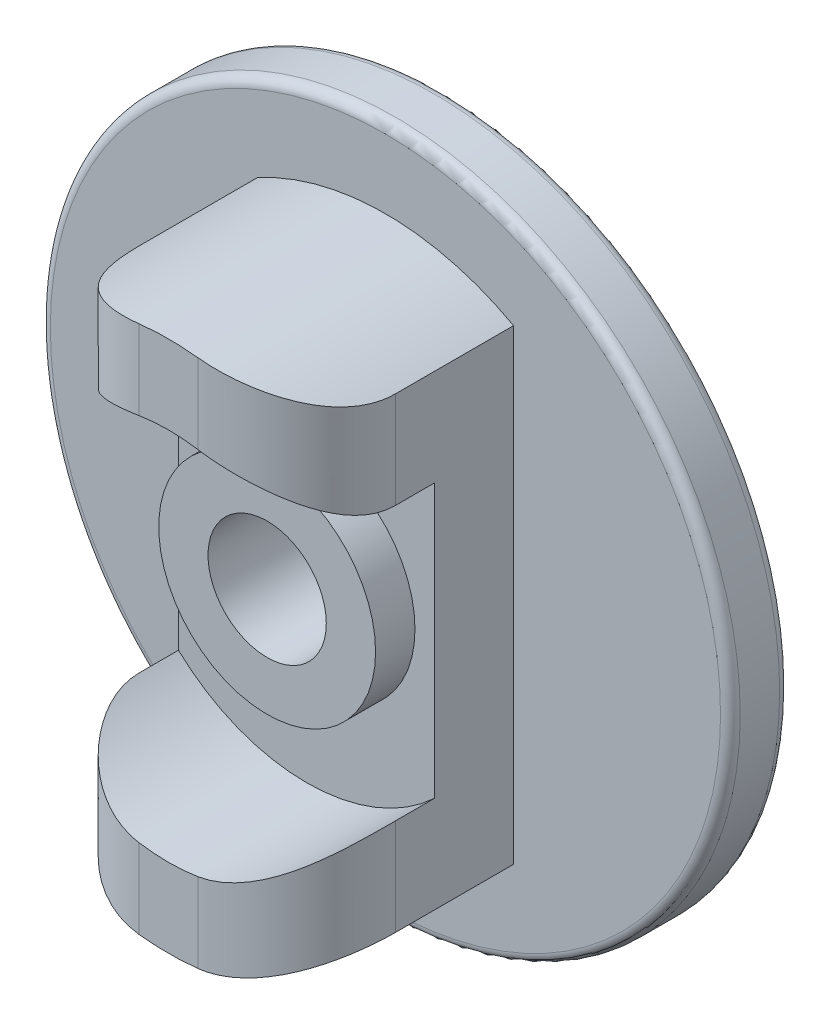
ISO-10303-21;
HEADER;
FILE_DESCRIPTION(('STEP AP214'),'2;1');
FILE_NAME('part.step','',(''),(''),'','','');
FILE_SCHEMA(('AUTOMOTIVE_DESIGN { 1 0 10303 214 1 1 1 1 }'));
ENDSEC;
DATA;
#1=APPLICATION_CONTEXT('core data for automotive mechanical design processes');
#2=APPLICATION_PROTOCOL_DEFINITION('international standard','automotive_design',2000,#1);
#3=PRODUCT_CONTEXT('',#1,'mechanical');
#4=PRODUCT('Part','Part','',(#3));
#5=PRODUCT_RELATED_PRODUCT_CATEGORY('part','',(#4));
#6=PRODUCT_DEFINITION_FORMATION('','',#4);
#7=PRODUCT_DEFINITION_CONTEXT('part definition',#1,'design');
#8=PRODUCT_DEFINITION('design','',#6,#7);
#9=PRODUCT_DEFINITION_SHAPE('','',#8);
#10=(LENGTH_UNIT() NAMED_UNIT(*) SI_UNIT(.MILLI.,.METRE.));
#11=(NAMED_UNIT(*) PLANE_ANGLE_UNIT() SI_UNIT($,.RADIAN.));
#12=(NAMED_UNIT(*) SI_UNIT($,.STERADIAN.) SOLID_ANGLE_UNIT());
#13=UNCERTAINTY_MEASURE_WITH_UNIT(LENGTH_MEASURE(1.E-05),#10,'distance_accuracy_value','');
#14=(GEOMETRIC_REPRESENTATION_CONTEXT(3) GLOBAL_UNCERTAINTY_ASSIGNED_CONTEXT((#13)) GLOBAL_UNIT_ASSIGNED_CONTEXT((#10,
#11,#12)) REPRESENTATION_CONTEXT('',''));
#15=CARTESIAN_POINT('',(0.,0.,0.));
#16=DIRECTION('',(0.,0.,1.));
#17=DIRECTION('',(1.,0.,0.));
#18=AXIS2_PLACEMENT_3D('',#15,#16,#17);
#19=CARTESIAN_POINT('',(0.,0.,14.));
#20=DIRECTION('',(0.,0.,1.));
#21=DIRECTION('',(1.,0.,0.));
#22=AXIS2_PLACEMENT_3D('',#19,#20,#21);
#23=PLANE('',#22);
#24=CARTESIAN_POINT('',(0.,0.,14.));
#25=DIRECTION('',(0.,0.,1.));
#26=DIRECTION('',(1.,0.,0.));
#27=AXIS2_PLACEMENT_3D('',#24,#25,#26);
#28=CIRCLE('',#27,13.5);
#29=CARTESIAN_POINT('',(1.50000000000002,13.4164078649988,14.));
#30=VERTEX_POINT('',#29);
#31=CARTESIAN_POINT('',(-1.5,13.4164078649987,14.));
#32=VERTEX_POINT('',#31);
#33=EDGE_CURVE('E308',#30,#32,#28,.T.);
#34=ORIENTED_EDGE('',*,*,#33,.T.);
#35=DIRECTION('',(0.,-1.,0.));
#36=VECTOR('',#35,1.);
#37=CARTESIAN_POINT('',(-1.5,6.92820323027551,14.));
#38=LINE('',#37,#36);
#39=CARTESIAN_POINT('',(-1.49999999999998,9.38083151964685,14.));
#40=VERTEX_POINT('',#39);
#41=EDGE_CURVE('E175',#32,#40,#38,.T.);
#42=ORIENTED_EDGE('',*,*,#41,.T.);
#43=CARTESIAN_POINT('',(0.,0.,14.));
#44=DIRECTION('',(0.,0.,1.));
#45=DIRECTION('',(1.,0.,0.));
#46=AXIS2_PLACEMENT_3D('',#43,#44,#45);
#47=CIRCLE('',#46,9.5);
#48=CARTESIAN_POINT('',(1.50000000000002,9.38083151964689,14.));
#49=VERTEX_POINT('',#48);
#50=EDGE_CURVE('E328',#49,#40,#47,.T.);
#51=ORIENTED_EDGE('',*,*,#50,.F.);
#52=DIRECTION('',(0.,1.,0.));
#53=VECTOR('',#52,1.);
#54=CARTESIAN_POINT('',(1.5,11.8321595661992,14.));
#55=LINE('',#54,#53);
#56=EDGE_CURVE('E172',#49,#30,#55,.T.);
#57=ORIENTED_EDGE('',*,*,#56,.T.);
#58=EDGE_LOOP('',(#34,#42,#51,#57));
#59=FACE_BOUND('',#58,.T.);
#60=ADVANCED_FACE('F34',(#59),#23,.T.);
#61=CARTESIAN_POINT('',(6.50000000000001,14.,14.));
#62=DIRECTION('',(-1.,0.,0.));
#63=DIRECTION('',(0.,-1.,0.));
#64=AXIS2_PLACEMENT_3D('',#61,#62,#63);
#65=PLANE('',#64);
#66=DIRECTION('',(0.,0.,1.));
#67=VECTOR('',#66,1.);
#68=CARTESIAN_POINT('',(6.50000000000003,11.8321595661992,3.));
#69=LINE('',#68,#67);
#70=CARTESIAN_POINT('',(6.50000000000003,11.8321595661992,8.99999999999999));
#71=VERTEX_POINT('',#70);
#72=CARTESIAN_POINT('',(6.50000000000003,11.8321595661992,3.));
#73=VERTEX_POINT('',#72);
#74=EDGE_CURVE('E125',#71,#73,#69,.F.);
#75=ORIENTED_EDGE('',*,*,#74,.F.);
#76=DIRECTION('',(0.,1.,0.));
#77=VECTOR('',#76,1.);
#78=CARTESIAN_POINT('',(6.50000000000001,6.92820323027554,8.99999999999999));
#79=LINE('',#78,#77);
#80=CARTESIAN_POINT('',(6.50000000000001,6.92820323027554,8.99999999999999));
#81=VERTEX_POINT('',#80);
#82=EDGE_CURVE('E343',#71,#81,#79,.F.);
#83=ORIENTED_EDGE('',*,*,#82,.T.);
#84=DIRECTION('',(0.,0.,1.));
#85=VECTOR('',#84,1.);
#86=CARTESIAN_POINT('',(6.50000000000001,6.92820323027554,7.));
#87=LINE('',#86,#85);
#88=CARTESIAN_POINT('',(6.50000000000001,6.92820323027554,7.));
#89=VERTEX_POINT('',#88);
#90=EDGE_CURVE('E337',#81,#89,#87,.F.);
#91=ORIENTED_EDGE('',*,*,#90,.T.);
#92=DIRECTION('',(0.,1.,0.));
#93=VECTOR('',#92,1.);
#94=CARTESIAN_POINT('',(6.50000000000001,14.,7.));
#95=LINE('',#94,#93);
#96=CARTESIAN_POINT('',(6.5,-6.92820323027551,7.));
#97=VERTEX_POINT('',#96);
#98=EDGE_CURVE('E153',#97,#89,#95,.T.);
#99=ORIENTED_EDGE('',*,*,#98,.F.);
#100=DIRECTION('',(0.,0.,1.));
#101=VECTOR('',#100,1.);
#102=CARTESIAN_POINT('',(6.5,-6.92820323027551,7.));
#103=LINE('',#102,#101);
#104=CARTESIAN_POINT('',(6.5,-6.92820323027551,8.99999999999999));
#105=VERTEX_POINT('',#104);
#106=EDGE_CURVE('E158',#97,#105,#103,.T.);
#107=ORIENTED_EDGE('',*,*,#106,.T.);
#108=DIRECTION('',(0.,1.,0.));
#109=VECTOR('',#108,1.);
#110=CARTESIAN_POINT('',(6.5,-11.8321595661992,8.99999999999999));
#111=LINE('',#110,#109);
#112=CARTESIAN_POINT('',(6.5,-11.8321595661992,8.99999999999999));
#113=VERTEX_POINT('',#112);
#114=EDGE_CURVE('E266',#105,#113,#111,.F.);
#115=ORIENTED_EDGE('',*,*,#114,.T.);
#116=DIRECTION('',(0.,0.,1.));
#117=VECTOR('',#116,1.);
#118=CARTESIAN_POINT('',(6.5,-11.8321595661992,3.));
#119=LINE('',#118,#117);
#120=CARTESIAN_POINT('',(6.5,-11.8321595661992,3.));
#121=VERTEX_POINT('',#120);
#122=EDGE_CURVE('E136',#121,#113,#119,.T.);
#123=ORIENTED_EDGE('',*,*,#122,.F.);
#124=DIRECTION('',(0.,1.,0.));
#125=VECTOR('',#124,1.);
#126=CARTESIAN_POINT('',(6.50000000000001,14.,3.));
#127=LINE('',#126,#125);
#128=EDGE_CURVE('E144',#121,#73,#127,.T.);
#129=ORIENTED_EDGE('',*,*,#128,.T.);
#130=EDGE_LOOP('',(#75,#83,#91,#99,#107,#115,#123,#129));
#131=FACE_BOUND('',#130,.T.);
#132=ADVANCED_FACE('F151',(#131),#65,.F.);
#133=CARTESIAN_POINT('',(-6.5,14.,14.));
#134=DIRECTION('',(1.,0.,0.));
#135=DIRECTION('',(0.,1.,0.));
#136=AXIS2_PLACEMENT_3D('',#133,#134,#135);
#137=PLANE('',#136);
#138=DIRECTION('',(0.,0.,1.));
#139=VECTOR('',#138,1.);
#140=CARTESIAN_POINT('',(-6.5,6.92820323027551,7.));
#141=LINE('',#140,#139);
#142=CARTESIAN_POINT('',(-6.5,6.92820323027551,7.));
#143=VERTEX_POINT('',#142);
#144=CARTESIAN_POINT('',(-6.5,6.92820323027551,8.99999999999999));
#145=VERTEX_POINT('',#144);
#146=EDGE_CURVE('E323',#143,#145,#141,.T.);
#147=ORIENTED_EDGE('',*,*,#146,.T.);
#148=DIRECTION('',(0.,-1.,0.));
#149=VECTOR('',#148,1.);
#150=CARTESIAN_POINT('',(-6.5,11.8321595661992,8.99999999999999));
#151=LINE('',#150,#149);
#152=CARTESIAN_POINT('',(-6.5,11.8321595661992,8.99999999999999));
#153=VERTEX_POINT('',#152);
#154=EDGE_CURVE('E317',#145,#153,#151,.F.);
#155=ORIENTED_EDGE('',*,*,#154,.T.);
#156=DIRECTION('',(0.,0.,1.));
#157=VECTOR('',#156,1.);
#158=CARTESIAN_POINT('',(-6.5,11.8321595661992,3.));
#159=LINE('',#158,#157);
#160=CARTESIAN_POINT('',(-6.5,11.8321595661992,3.));
#161=VERTEX_POINT('',#160);
#162=EDGE_CURVE('E137',#161,#153,#159,.T.);
#163=ORIENTED_EDGE('',*,*,#162,.F.);
#164=DIRECTION('',(0.,-1.,0.));
#165=VECTOR('',#164,1.);
#166=CARTESIAN_POINT('',(-6.5,14.,3.));
#167=LINE('',#166,#165);
#168=CARTESIAN_POINT('',(-6.50000000000005,-11.8321595661993,3.));
#169=VERTEX_POINT('',#168);
#170=EDGE_CURVE('E146',#161,#169,#167,.T.);
#171=ORIENTED_EDGE('',*,*,#170,.T.);
#172=DIRECTION('',(0.,0.,1.));
#173=VECTOR('',#172,1.);
#174=CARTESIAN_POINT('',(-6.50000000000005,-11.8321595661993,3.));
#175=LINE('',#174,#173);
#176=CARTESIAN_POINT('',(-6.50000000000005,-11.8321595661993,8.99999999999999));
#177=VERTEX_POINT('',#176);
#178=EDGE_CURVE('E147',#177,#169,#175,.F.);
#179=ORIENTED_EDGE('',*,*,#178,.F.);
#180=DIRECTION('',(0.,-1.,0.));
#181=VECTOR('',#180,1.);
#182=CARTESIAN_POINT('',(-6.50000000000004,-6.92820323027551,8.99999999999999));
#183=LINE('',#182,#181);
#184=CARTESIAN_POINT('',(-6.50000000000004,-6.92820323027551,8.99999999999999));
#185=VERTEX_POINT('',#184);
#186=EDGE_CURVE('E319',#177,#185,#183,.F.);
#187=ORIENTED_EDGE('',*,*,#186,.T.);
#188=DIRECTION('',(0.,0.,1.));
#189=VECTOR('',#188,1.);
#190=CARTESIAN_POINT('',(-6.50000000000004,-6.92820323027551,7.));
#191=LINE('',#190,#189);
#192=CARTESIAN_POINT('',(-6.50000000000004,-6.92820323027551,7.));
#193=VERTEX_POINT('',#192);
#194=EDGE_CURVE('E332',#185,#193,#191,.F.);
#195=ORIENTED_EDGE('',*,*,#194,.T.);
#196=DIRECTION('',(0.,-1.,0.));
#197=VECTOR('',#196,1.);
#198=CARTESIAN_POINT('',(-6.5,14.,7.));
#199=LINE('',#198,#197);
#200=EDGE_CURVE('E166',#143,#193,#199,.T.);
#201=ORIENTED_EDGE('',*,*,#200,.F.);
#202=EDGE_LOOP('',(#147,#155,#163,#171,#179,#187,#195,#201));
#203=FACE_BOUND('',#202,.T.);
#204=ADVANCED_FACE('F295',(#203),#137,.F.);
#205=CARTESIAN_POINT('',(0.,0.,14.));
#206=DIRECTION('',(0.,0.,1.));
#207=DIRECTION('',(1.,0.,0.));
#208=AXIS2_PLACEMENT_3D('',#205,#206,#207);
#209=CIRCLE('',#208,9.5);
#210=CARTESIAN_POINT('',(-1.50000000000002,-9.38083151964687,14.));
#211=VERTEX_POINT('',#210);
#212=CARTESIAN_POINT('',(1.49999999999999,-9.38083151964687,14.));
#213=VERTEX_POINT('',#212);
#214=EDGE_CURVE('E164',#211,#213,#209,.T.);
#215=ORIENTED_EDGE('',*,*,#214,.F.);
#216=DIRECTION('',(0.,-1.,0.));
#217=VECTOR('',#216,1.);
#218=CARTESIAN_POINT('',(-1.50000000000004,-11.8321595661993,14.));
#219=LINE('',#218,#217);
#220=CARTESIAN_POINT('',(-1.5,-13.4164078649987,14.));
#221=VERTEX_POINT('',#220);
#222=EDGE_CURVE('E242',#211,#221,#219,.T.);
#223=ORIENTED_EDGE('',*,*,#222,.T.);
#224=CARTESIAN_POINT('',(0.,0.,14.));
#225=DIRECTION('',(0.,0.,1.));
#226=DIRECTION('',(1.,0.,0.));
#227=AXIS2_PLACEMENT_3D('',#224,#225,#226);
#228=CIRCLE('',#227,13.5);
#229=CARTESIAN_POINT('',(1.49999999999999,-13.4164078649987,14.));
#230=VERTEX_POINT('',#229);
#231=EDGE_CURVE('E169',#221,#230,#228,.T.);
#232=ORIENTED_EDGE('',*,*,#231,.T.);
#233=DIRECTION('',(0.,1.,0.));
#234=VECTOR('',#233,1.);
#235=CARTESIAN_POINT('',(1.49999999999999,-6.92820323027551,14.));
#236=LINE('',#235,#234);
#237=EDGE_CURVE('E344',#230,#213,#236,.T.);
#238=ORIENTED_EDGE('',*,*,#237,.T.);
#239=EDGE_LOOP('',(#215,#223,#232,#238));
#240=FACE_BOUND('',#239,.T.);
#241=ADVANCED_FACE('F277',(#240),#23,.T.);
#242=CARTESIAN_POINT('',(0.,0.,3.));
#243=DIRECTION('',(0.,0.,-1.));
#244=DIRECTION('',(-1.,0.,0.));
#245=AXIS2_PLACEMENT_3D('',#242,#243,#244);
#246=CYLINDRICAL_SURFACE('',#245,17.5);
#247=CARTESIAN_POINT('',(0.,0.,0.5));
#248=DIRECTION('',(0.,0.,1.));
#249=DIRECTION('',(1.,0.,0.));
#250=AXIS2_PLACEMENT_3D('',#247,#248,#249);
#251=CIRCLE('',#250,17.5);
#252=CARTESIAN_POINT('',(17.5,0.,0.5));
#253=VERTEX_POINT('',#252);
#254=EDGE_CURVE('E42',#253,#253,#251,.T.);
#255=ORIENTED_EDGE('',*,*,#254,.T.);
#256=EDGE_LOOP('',(#255));
#257=FACE_BOUND('',#256,.T.);
#258=CARTESIAN_POINT('',(0.,0.,2.5));
#259=DIRECTION('',(0.,0.,1.));
#260=DIRECTION('',(1.,0.,0.));
#261=AXIS2_PLACEMENT_3D('',#258,#259,#260);
#262=CIRCLE('',#261,17.5);
#263=CARTESIAN_POINT('',(17.5,0.,2.5));
#264=VERTEX_POINT('',#263);
#265=EDGE_CURVE('E395',#264,#264,#262,.F.);
#266=ORIENTED_EDGE('',*,*,#265,.T.);
#267=EDGE_LOOP('',(#266));
#268=FACE_BOUND('',#267,.T.);
#269=ADVANCED_FACE('F273',(#257,#268),#246,.T.);
#270=CARTESIAN_POINT('',(0.,0.,3.));
#271=DIRECTION('',(0.,0.,1.));
#272=DIRECTION('',(1.,0.,0.));
#273=AXIS2_PLACEMENT_3D('',#270,#271,#272);
#274=PLANE('',#273);
#275=CARTESIAN_POINT('',(0.,0.,3.));
#276=DIRECTION('',(0.,0.,1.));
#277=DIRECTION('',(1.,0.,0.));
#278=AXIS2_PLACEMENT_3D('',#275,#276,#277);
#279=CIRCLE('',#278,17.);
#280=CARTESIAN_POINT('',(17.,0.,3.));
#281=VERTEX_POINT('',#280);
#282=EDGE_CURVE('E11',#281,#281,#279,.T.);
#283=ORIENTED_EDGE('',*,*,#282,.T.);
#284=EDGE_LOOP('',(#283));
#285=FACE_BOUND('',#284,.T.);
#286=ORIENTED_EDGE('',*,*,#128,.F.);
#287=CARTESIAN_POINT('',(0.,0.,3.));
#288=DIRECTION('',(0.,0.,1.));
#289=DIRECTION('',(1.,0.,0.));
#290=AXIS2_PLACEMENT_3D('',#287,#288,#289);
#291=CIRCLE('',#290,13.5);
#292=EDGE_CURVE('E148',#169,#121,#291,.T.);
#293=ORIENTED_EDGE('',*,*,#292,.F.);
#294=ORIENTED_EDGE('',*,*,#170,.F.);
#295=EDGE_CURVE('E129',#73,#161,#291,.T.);
#296=ORIENTED_EDGE('',*,*,#295,.F.);
#297=EDGE_LOOP('',(#286,#293,#294,#296));
#298=FACE_BOUND('',#297,.T.);
#299=ADVANCED_FACE('F142',(#285,#298),#274,.T.);
#300=CARTESIAN_POINT('',(0.,0.,0.));
#301=DIRECTION('',(0.,0.,1.));
#302=DIRECTION('',(1.,0.,0.));
#303=AXIS2_PLACEMENT_3D('',#300,#301,#302);
#304=PLANE('',#303);
#305=CARTESIAN_POINT('',(0.,0.,0.));
#306=DIRECTION('',(0.,0.,1.));
#307=DIRECTION('',(1.,0.,0.));
#308=AXIS2_PLACEMENT_3D('',#305,#306,#307);
#309=CIRCLE('',#308,16.);
#310=CARTESIAN_POINT('',(16.,0.,0.));
#311=VERTEX_POINT('',#310);
#312=EDGE_CURVE('E390',#311,#311,#309,.T.);
#313=ORIENTED_EDGE('',*,*,#312,.T.);
#314=EDGE_LOOP('',(#313));
#315=FACE_BOUND('',#314,.T.);
#316=CARTESIAN_POINT('',(0.,0.,0.));
#317=DIRECTION('',(0.,0.,1.));
#318=DIRECTION('',(1.,0.,0.));
#319=AXIS2_PLACEMENT_3D('',#316,#317,#318);
#320=CIRCLE('',#319,17.);
#321=CARTESIAN_POINT('',(17.,0.,0.));
#322=VERTEX_POINT('',#321);
#323=EDGE_CURVE('E387',#322,#322,#320,.F.);
#324=ORIENTED_EDGE('',*,*,#323,.T.);
#325=EDGE_LOOP('',(#324));
#326=FACE_BOUND('',#325,.T.);
#327=ADVANCED_FACE('F279',(#315,#326),#304,.F.);
#328=CARTESIAN_POINT('',(0.,0.,1.));
#329=DIRECTION('',(0.,0.,-1.));
#330=DIRECTION('',(-1.,0.,0.));
#331=AXIS2_PLACEMENT_3D('',#328,#329,#330);
#332=CYLINDRICAL_SURFACE('',#331,15.5);
#333=CARTESIAN_POINT('',(0.,0.,0.5));
#334=DIRECTION('',(0.,0.,1.));
#335=DIRECTION('',(1.,0.,0.));
#336=AXIS2_PLACEMENT_3D('',#333,#334,#335);
#337=CIRCLE('',#336,15.5);
#338=CARTESIAN_POINT('',(15.5,0.,0.5));
#339=VERTEX_POINT('',#338);
#340=EDGE_CURVE('E385',#339,#339,#337,.F.);
#341=ORIENTED_EDGE('',*,*,#340,.T.);
#342=EDGE_LOOP('',(#341));
#343=FACE_BOUND('',#342,.T.);
#344=CARTESIAN_POINT('',(0.,0.,1.));
#345=DIRECTION('',(0.,0.,-1.));
#346=DIRECTION('',(-1.,0.,0.));
#347=AXIS2_PLACEMENT_3D('',#344,#345,#346);
#348=CIRCLE('',#347,15.5);
#349=CARTESIAN_POINT('',(-15.5,0.,1.));
#350=VERTEX_POINT('',#349);
#351=EDGE_CURVE('E155',#350,#350,#348,.T.);
#352=ORIENTED_EDGE('',*,*,#351,.F.);
#353=EDGE_LOOP('',(#352));
#354=FACE_BOUND('',#353,.T.);
#355=ADVANCED_FACE('F282',(#343,#354),#332,.F.);
#356=CARTESIAN_POINT('',(0.,0.,1.));
#357=DIRECTION('',(0.,0.,-1.));
#358=DIRECTION('',(-1.,0.,0.));
#359=AXIS2_PLACEMENT_3D('',#356,#357,#358);
#360=PLANE('',#359);
#361=CARTESIAN_POINT('',(0.,0.,1.));
#362=DIRECTION('',(0.,0.,-1.));
#363=DIRECTION('',(-1.,0.,0.));
#364=AXIS2_PLACEMENT_3D('',#361,#362,#363);
#365=CIRCLE('',#364,3.);
#366=CARTESIAN_POINT('',(-3.00000000000001,0.,1.));
#367=VERTEX_POINT('',#366);
#368=EDGE_CURVE('E354',#367,#367,#365,.T.);
#369=ORIENTED_EDGE('',*,*,#368,.F.);
#370=EDGE_LOOP('',(#369));
#371=FACE_BOUND('',#370,.T.);
#372=ORIENTED_EDGE('',*,*,#351,.T.);
#373=EDGE_LOOP('',(#372));
#374=FACE_BOUND('',#373,.T.);
#375=ADVANCED_FACE('F289',(#371,#374),#360,.T.);
#376=CARTESIAN_POINT('',(0.,0.,7.));
#377=DIRECTION('',(0.,0.,1.));
#378=DIRECTION('',(1.,0.,0.));
#379=AXIS2_PLACEMENT_3D('',#376,#377,#378);
#380=PLANE('',#379);
#381=CARTESIAN_POINT('',(0.,0.,7.));
#382=DIRECTION('',(0.,0.,1.));
#383=DIRECTION('',(1.,0.,0.));
#384=AXIS2_PLACEMENT_3D('',#381,#382,#383);
#385=CIRCLE('',#384,5.5);
#386=CARTESIAN_POINT('',(5.50000000000001,0.,7.));
#387=VERTEX_POINT('',#386);
#388=EDGE_CURVE('E351',#387,#387,#385,.T.);
#389=ORIENTED_EDGE('',*,*,#388,.F.);
#390=EDGE_LOOP('',(#389));
#391=FACE_BOUND('',#390,.T.);
#392=ORIENTED_EDGE('',*,*,#98,.T.);
#393=CARTESIAN_POINT('',(0.,0.,7.));
#394=DIRECTION('',(0.,0.,1.));
#395=DIRECTION('',(1.,0.,0.));
#396=AXIS2_PLACEMENT_3D('',#393,#394,#395);
#397=CIRCLE('',#396,9.5);
#398=EDGE_CURVE('E329',#89,#143,#397,.T.);
#399=ORIENTED_EDGE('',*,*,#398,.T.);
#400=ORIENTED_EDGE('',*,*,#200,.T.);
#401=EDGE_CURVE('E333',#193,#97,#397,.T.);
#402=ORIENTED_EDGE('',*,*,#401,.T.);
#403=EDGE_LOOP('',(#392,#399,#400,#402));
#404=FACE_BOUND('',#403,.T.);
#405=ADVANCED_FACE('F202',(#391,#404),#380,.T.);
#406=CARTESIAN_POINT('',(0.,0.,7.));
#407=DIRECTION('',(0.,0.,1.));
#408=DIRECTION('',(1.,0.,0.));
#409=AXIS2_PLACEMENT_3D('',#406,#407,#408);
#410=CYLINDRICAL_SURFACE('',#409,9.5);
#411=ORIENTED_EDGE('',*,*,#194,.F.);
#412=CARTESIAN_POINT('',(-6.50000000000004,-6.92820323027551,8.99999999999999));
#413=CARTESIAN_POINT('',(-6.5000320521124,-6.92814283840357,9.12030380158095));
#414=CARTESIAN_POINT('',(-6.49565949680199,-6.93227505330145,9.24056863593133));
#415=CARTESIAN_POINT('',(-6.47836060075672,-6.94845987766344,9.47979470262765));
#416=CARTESIAN_POINT('',(-6.46544525857244,-6.96050230286007,9.59875741148492));
#417=CARTESIAN_POINT('',(-6.43148594493999,-6.99188696500527,9.83328787181541));
#418=CARTESIAN_POINT('',(-6.41052468002583,-7.01115488387362,9.94887769215033));
#419=CARTESIAN_POINT('',(-6.36087806235677,-7.05622838580483,10.1770781997922));
#420=CARTESIAN_POINT('',(-6.3321906086426,-7.0820357470055,10.2896880676087));
#421=CARTESIAN_POINT('',(-6.23553437619206,-7.16766989867722,10.620913588169));
#422=CARTESIAN_POINT('',(-6.15676424103778,-7.23591081359361,10.8343026539286));
#423=CARTESIAN_POINT('',(-5.97367942474763,-7.3877801136041,11.2443000062161));
#424=CARTESIAN_POINT('',(-5.86929454883077,-7.47145062276511,11.4408601434941));
#425=CARTESIAN_POINT('',(-5.62033041543343,-7.66093152846847,11.8437740407077));
#426=CARTESIAN_POINT('',(-5.47206983969242,-7.76818004691898,12.0471696888197));
#427=CARTESIAN_POINT('',(-5.14800813945533,-7.98662695662914,12.4285087775791));
#428=CARTESIAN_POINT('',(-4.97218906267865,-8.09782788581532,12.6064354815606));
#429=CARTESIAN_POINT('',(-4.66982131461535,-8.27406878579117,12.8697592120123));
#430=CARTESIAN_POINT('',(-4.55128864293033,-8.33997097494751,12.9639199671192));
#431=CARTESIAN_POINT('',(-4.30530292468334,-8.4695735100889,13.1416543622554));
#432=CARTESIAN_POINT('',(-4.17784752063182,-8.53327326747417,13.225225187788));
#433=CARTESIAN_POINT('',(-3.91478420293592,-8.65711101625794,13.3808832351648));
#434=CARTESIAN_POINT('',(-3.77918958284351,-8.71725451329553,13.4529885162531));
#435=CARTESIAN_POINT('',(-3.50038486617755,-8.83289636532303,13.5850003393489));
#436=CARTESIAN_POINT('',(-3.35717955112895,-8.88839758176597,13.6449144290026));
#437=CARTESIAN_POINT('',(-3.07729126689408,-8.98890047932762,13.746816609569));
#438=CARTESIAN_POINT('',(-2.94119962071748,-9.03439799149771,13.7899394485499));
#439=CARTESIAN_POINT('',(-2.66424406297507,-9.11991282183186,13.8646793017535));
#440=CARTESIAN_POINT('',(-2.5233815070118,-9.15993168066889,13.8962995548243));
#441=CARTESIAN_POINT('',(-2.2369090057206,-9.23407914993435,13.947550194762));
#442=CARTESIAN_POINT('',(-2.09127347735431,-9.26816627669305,13.967098400247));
#443=CARTESIAN_POINT('',(-1.79730301071984,-9.32965545947829,13.9933449648917));
#444=CARTESIAN_POINT('',(-1.64896540823367,-9.3570504856893,14.0000298618457));
#445=CARTESIAN_POINT('',(-1.50000000000002,-9.38083151964687,14.));
#446=B_SPLINE_CURVE_WITH_KNOTS('',3,(#412,#413,#414,#415,#416,#417,#418,#419,#420,#421,#422,
#423,#424,#425,#426,#427,#428,#429,#430,#431,#432,#433,#434,#435,#436,#437,#438,#439,#440,#441,
#442,#443,#444,#445),.UNSPECIFIED.,.F.,.F.,(4,2,2,2,2,2,2,2,2,2,2,2,2,2,2,2,4),(0.,
0.36069823179494,0.720932978311853,1.07755984927857,1.43428379480217,2.14356380546601,
2.85480967387222,3.67280823905639,4.49134190019005,4.9861383795286,5.48106608686214,
5.97520634780178,6.46903974616573,6.91796026243399,7.36675427559004,7.81857074765402,
8.27085981548523),.UNSPECIFIED.);
#447=EDGE_CURVE('E57',#185,#211,#446,.T.);
#448=ORIENTED_EDGE('',*,*,#447,.T.);
#449=ORIENTED_EDGE('',*,*,#214,.T.);
#450=CARTESIAN_POINT('',(1.49999999999999,-9.38083151964687,14.));
#451=CARTESIAN_POINT('',(1.63770772671039,-9.3588405592717,14.0000224064928));
#452=CARTESIAN_POINT('',(1.77488743479732,-9.33376844342896,13.9943125149502));
#453=CARTESIAN_POINT('',(2.04704908941457,-9.27786236733786,13.971851263545));
#454=CARTESIAN_POINT('',(2.1820326267127,-9.24703279970992,13.9551082968522));
#455=CARTESIAN_POINT('',(2.44804906603483,-9.18018467088469,13.9111389187246));
#456=CARTESIAN_POINT('',(2.57910121123306,-9.14419931509961,13.8839778576151));
#457=CARTESIAN_POINT('',(2.83729884392394,-9.06740716102843,13.8196818012185));
#458=CARTESIAN_POINT('',(2.9644436878862,-9.02659957382932,13.7825451726682));
#459=CARTESIAN_POINT('',(3.21372090933907,-8.94087889088581,13.698977382017));
#460=CARTESIAN_POINT('',(3.33586762529893,-8.89597893675818,13.6525754387579));
#461=CARTESIAN_POINT('',(3.57503199906829,-8.80259350280225,13.5509491108842));
#462=CARTESIAN_POINT('',(3.692047830392,-8.75410676239609,13.4957216165371));
#463=CARTESIAN_POINT('',(4.03496859131777,-8.60413932568484,13.3174466486942));
#464=CARTESIAN_POINT('',(4.25254688163383,-8.49822168674641,13.1818748358381));
#465=CARTESIAN_POINT('',(4.68483979738341,-8.26852363378006,12.8647526817297));
#466=CARTESIAN_POINT('',(4.89669934728691,-8.14405026687353,12.6798153068791));
#467=CARTESIAN_POINT('',(5.18932404431073,-7.95828826003485,12.3776561359306));
#468=CARTESIAN_POINT('',(5.28273212541104,-7.8964795762716,12.2727228414471));
#469=CARTESIAN_POINT('',(5.46077981012711,-7.7744154617515,12.0548377394131));
#470=CARTESIAN_POINT('',(5.54541940931267,-7.71416003177944,11.9418859278114));
#471=CARTESIAN_POINT('',(5.76747660091004,-7.55096962763436,11.6175862557266));
#472=CARTESIAN_POINT('',(5.89509316719756,-7.45106311970402,11.3976934719923));
#473=CARTESIAN_POINT('',(6.06163557175673,-7.3151720711041,11.0513004477118));
#474=CARTESIAN_POINT('',(6.11293873137634,-7.27226219823625,10.9332842762292));
#475=CARTESIAN_POINT('',(6.20683904464752,-7.19228326838355,10.6918698182369));
#476=CARTESIAN_POINT('',(6.24943690061521,-7.15521374027364,10.5684719668793));
#477=CARTESIAN_POINT('',(6.32162655123498,-7.09148359104826,10.3289236508426));
#478=CARTESIAN_POINT('',(6.35207148271763,-7.06416730275752,10.2132050110564));
#479=CARTESIAN_POINT('',(6.40478232916377,-7.01641084236868,9.97855311818516));
#480=CARTESIAN_POINT('',(6.42705133457189,-6.9959680723738,9.85962109802405));
#481=CARTESIAN_POINT('',(6.46317883290971,-6.96261234321143,9.61799470555209));
#482=CARTESIAN_POINT('',(6.4769373137719,-6.94978899073322,9.49527275530144));
#483=CARTESIAN_POINT('',(6.49537318109595,-6.93254366801143,9.24838289879223));
#484=CARTESIAN_POINT('',(6.50003682914642,-6.92813440808659,9.12421308959638));
#485=CARTESIAN_POINT('',(6.5,-6.92820323027551,8.99999999999999));
#486=B_SPLINE_CURVE_WITH_KNOTS('',3,(#450,#451,#452,#453,#454,#455,#456,#457,#458,#459,#460,
#461,#462,#463,#464,#465,#466,#467,#468,#469,#470,#471,#472,#473,#474,#475,#476,#477,#478,#479,
#480,#481,#482,#483,#484,#485),.UNSPECIFIED.,.F.,.F.,(4,2,2,2,2,2,2,2,2,2,2,2,2,2,2,2,2,4),(0.,
0.418154043716252,0.835990352576074,1.251247435502,1.66657254843649,2.08060802108359,
2.49478970443414,3.32381371124477,4.24250467705752,4.70254106674353,5.16257768885814,
5.97836280815053,6.38492329685177,6.79145097258973,7.15919186743751,7.52679361525957,
7.89863704051823,8.27104172875864),.UNSPECIFIED.);
#487=EDGE_CURVE('E49',#213,#105,#486,.T.);
#488=ORIENTED_EDGE('',*,*,#487,.T.);
#489=ORIENTED_EDGE('',*,*,#106,.F.);
#490=ORIENTED_EDGE('',*,*,#401,.F.);
#491=EDGE_LOOP('',(#411,#448,#449,#488,#489,#490));
#492=FACE_BOUND('',#491,.T.);
#493=ADVANCED_FACE('F196',(#492),#410,.F.);
#494=ORIENTED_EDGE('',*,*,#50,.T.);
#495=CARTESIAN_POINT('',(-1.49999999999998,9.38083151964685,14.));
#496=CARTESIAN_POINT('',(-1.63770772671038,9.35884055927169,14.0000224064928));
#497=CARTESIAN_POINT('',(-1.77488743479731,9.33376844342896,13.9943125149502));
#498=CARTESIAN_POINT('',(-2.04704908941457,9.27786236733786,13.971851263545));
#499=CARTESIAN_POINT('',(-2.1820326267127,9.24703279970992,13.9551082968522));
#500=CARTESIAN_POINT('',(-2.44804906603483,9.18018467088469,13.9111389187246));
#501=CARTESIAN_POINT('',(-2.57910121123306,9.14419931509961,13.8839778576151));
#502=CARTESIAN_POINT('',(-2.83729884392394,9.06740716102843,13.8196818012185));
#503=CARTESIAN_POINT('',(-2.9644436878862,9.02659957382932,13.7825451726682));
#504=CARTESIAN_POINT('',(-3.21372090933907,8.94087889088581,13.698977382017));
#505=CARTESIAN_POINT('',(-3.33586762529893,8.89597893675818,13.6525754387579));
#506=CARTESIAN_POINT('',(-3.57503199906829,8.80259350280225,13.5509491108842));
#507=CARTESIAN_POINT('',(-3.69204783039201,8.75410676239609,13.4957216165371));
#508=CARTESIAN_POINT('',(-4.03496859131778,8.60413932568483,13.3174466486942));
#509=CARTESIAN_POINT('',(-4.25254688163384,8.4982216867464,13.1818748358381));
#510=CARTESIAN_POINT('',(-4.68483979738342,8.26852363378005,12.8647526817297));
#511=CARTESIAN_POINT('',(-4.89669934728692,8.14405026687352,12.6798153068791));
#512=CARTESIAN_POINT('',(-5.18932404431073,7.95828826003484,12.3776561359306));
#513=CARTESIAN_POINT('',(-5.28273212541105,7.89647957627159,12.2727228414471));
#514=CARTESIAN_POINT('',(-5.46077981012712,7.7744154617515,12.0548377394131));
#515=CARTESIAN_POINT('',(-5.54541940931267,7.71416003177944,11.9418859278114));
#516=CARTESIAN_POINT('',(-5.76747660091004,7.55096962763437,11.6175862557266));
#517=CARTESIAN_POINT('',(-5.89509316719756,7.45106311970402,11.3976934719923));
#518=CARTESIAN_POINT('',(-6.06163557175673,7.3151720711041,11.0513004477118));
#519=CARTESIAN_POINT('',(-6.11293873137635,7.27226219823624,10.9332842762292));
#520=CARTESIAN_POINT('',(-6.20683904464752,7.19228326838355,10.6918698182369));
#521=CARTESIAN_POINT('',(-6.24943690061521,7.15521374027365,10.5684719668793));
#522=CARTESIAN_POINT('',(-6.32162655123498,7.09148359104826,10.3289236508426));
#523=CARTESIAN_POINT('',(-6.35207148271763,7.06416730275752,10.2132050110564));
#524=CARTESIAN_POINT('',(-6.40478232916377,7.01641084236868,9.97855311818516));
#525=CARTESIAN_POINT('',(-6.4270513345719,6.99596807237379,9.85962109802405));
#526=CARTESIAN_POINT('',(-6.46317883290972,6.96261234321143,9.61799470555209));
#527=CARTESIAN_POINT('',(-6.4769373137719,6.94978899073322,9.49527275530144));
#528=CARTESIAN_POINT('',(-6.49537318109596,6.93254366801143,9.24838289879223));
#529=CARTESIAN_POINT('',(-6.50003682914642,6.92813440808659,9.12421308959638));
#530=CARTESIAN_POINT('',(-6.5,6.92820323027551,8.99999999999999));
#531=B_SPLINE_CURVE_WITH_KNOTS('',3,(#495,#496,#497,#498,#499,#500,#501,#502,#503,#504,#505,
#506,#507,#508,#509,#510,#511,#512,#513,#514,#515,#516,#517,#518,#519,#520,#521,#522,#523,#524,
#525,#526,#527,#528,#529,#530),.UNSPECIFIED.,.F.,.F.,(4,2,2,2,2,2,2,2,2,2,2,2,2,2,2,2,2,4),(0.,
0.418154043716254,0.835990352576076,1.25124743550201,1.6665725484365,2.0806080210836,
2.49478970443416,3.32381371124479,4.24250467705753,4.70254106674353,5.16257768885814,
5.97836280815054,6.38492329685178,6.79145097258973,7.15919186743752,7.52679361525957,
7.89863704051823,8.27104172875865),.UNSPECIFIED.);
#532=EDGE_CURVE('E186',#40,#145,#531,.T.);
#533=ORIENTED_EDGE('',*,*,#532,.T.);
#534=ORIENTED_EDGE('',*,*,#146,.F.);
#535=ORIENTED_EDGE('',*,*,#398,.F.);
#536=ORIENTED_EDGE('',*,*,#90,.F.);
#537=CARTESIAN_POINT('',(6.50000000000001,6.92820323027554,8.99999999999999));
#538=CARTESIAN_POINT('',(6.50003205211239,6.92814283840359,9.12030380158095));
#539=CARTESIAN_POINT('',(6.49565949680199,6.93227505330146,9.24056863593133));
#540=CARTESIAN_POINT('',(6.47836060075672,6.94845987766345,9.47979470262765));
#541=CARTESIAN_POINT('',(6.46544525857244,6.96050230286007,9.59875741148492));
#542=CARTESIAN_POINT('',(6.43148594493998,6.99188696500527,9.83328787181542));
#543=CARTESIAN_POINT('',(6.41052468002583,7.01115488387363,9.94887769215034));
#544=CARTESIAN_POINT('',(6.36087806235676,7.05622838580483,10.1770781997922));
#545=CARTESIAN_POINT('',(6.33219060864257,7.08203574700549,10.2896880676087));
#546=CARTESIAN_POINT('',(6.23553437619202,7.16766989867722,10.620913588169));
#547=CARTESIAN_POINT('',(6.15676424103777,7.23591081359362,10.8343026539286));
#548=CARTESIAN_POINT('',(5.97367942474763,7.3877801136041,11.2443000062161));
#549=CARTESIAN_POINT('',(5.86929454883073,7.4714506227651,11.4408601434941));
#550=CARTESIAN_POINT('',(5.62033041543338,7.66093152846846,11.8437740407077));
#551=CARTESIAN_POINT('',(5.4720698396924,7.76818004691899,12.0471696888197));
#552=CARTESIAN_POINT('',(5.14800813945532,7.98662695662914,12.4285087775791));
#553=CARTESIAN_POINT('',(4.97218906267861,8.0978278858153,12.6064354815606));
#554=CARTESIAN_POINT('',(4.66982131461532,8.27406878579115,12.8697592120123));
#555=CARTESIAN_POINT('',(4.55128864293032,8.33997097494751,12.9639199671192));
#556=CARTESIAN_POINT('',(4.30530292468333,8.46957351008892,13.1416543622554));
#557=CARTESIAN_POINT('',(4.17784752063181,8.53327326747418,13.225225187788));
#558=CARTESIAN_POINT('',(3.9147842029359,8.65711101625795,13.3808832351648));
#559=CARTESIAN_POINT('',(3.77918958284349,8.71725451329554,13.4529885162531));
#560=CARTESIAN_POINT('',(3.50038486617753,8.83289636532304,13.5850003393489));
#561=CARTESIAN_POINT('',(3.35717955112892,8.88839758176597,13.6449144290026));
#562=CARTESIAN_POINT('',(3.07729126689405,8.98890047932762,13.746816609569));
#563=CARTESIAN_POINT('',(2.94119962071746,9.03439799149772,13.7899394485499));
#564=CARTESIAN_POINT('',(2.66424406297505,9.11991282183187,13.8646793017535));
#565=CARTESIAN_POINT('',(2.52338150701178,9.1599316806689,13.8962995548243));
#566=CARTESIAN_POINT('',(2.23690900572059,9.23407914993435,13.947550194762));
#567=CARTESIAN_POINT('',(2.09127347735429,9.26816627669305,13.967098400247));
#568=CARTESIAN_POINT('',(1.79730301071983,9.32965545947829,13.9933449648917));
#569=CARTESIAN_POINT('',(1.64896540823366,9.35705048568931,14.0000298618457));
#570=CARTESIAN_POINT('',(1.50000000000002,9.38083151964689,14.));
#571=B_SPLINE_CURVE_WITH_KNOTS('',3,(#537,#538,#539,#540,#541,#542,#543,#544,#545,#546,#547,
#548,#549,#550,#551,#552,#553,#554,#555,#556,#557,#558,#559,#560,#561,#562,#563,#564,#565,#566,
#567,#568,#569,#570),.UNSPECIFIED.,.F.,.F.,(4,2,2,2,2,2,2,2,2,2,2,2,2,2,2,2,4),(0.,
0.360698231794944,0.720932978311858,1.07755984927857,1.43428379480217,2.14356380546602,
2.85480967387223,3.6728082390564,4.49134190019005,4.9861383795286,5.48106608686215,
5.97520634780178,6.46903974616574,6.917960262434,7.36675427559004,7.81857074765402,
8.27085981548522),.UNSPECIFIED.);
#572=EDGE_CURVE('E178',#81,#49,#571,.T.);
#573=ORIENTED_EDGE('',*,*,#572,.T.);
#574=EDGE_LOOP('',(#494,#533,#534,#535,#536,#573));
#575=FACE_BOUND('',#574,.T.);
#576=ADVANCED_FACE('F201',(#575),#410,.F.);
#577=CARTESIAN_POINT('',(0.,0.,3.));
#578=DIRECTION('',(0.,0.,1.));
#579=DIRECTION('',(1.,0.,0.));
#580=AXIS2_PLACEMENT_3D('',#577,#578,#579);
#581=CYLINDRICAL_SURFACE('',#580,13.5);
#582=ORIENTED_EDGE('',*,*,#231,.F.);
#583=CARTESIAN_POINT('',(-1.5,-13.4164078649987,14.));
#584=CARTESIAN_POINT('',(-1.63954789746117,-13.4008265795342,14.0000178135218));
#585=CARTESIAN_POINT('',(-1.77882495156349,-13.3830304667782,13.9941586171832));
#586=CARTESIAN_POINT('',(-2.05576202329788,-13.3432850829242,13.9709537568505));
#587=CARTESIAN_POINT('',(-2.19342271422006,-13.321337611325,13.9536130616538));
#588=CARTESIAN_POINT('',(-2.46565710299756,-13.2736426538116,13.9077993309574));
#589=CARTESIAN_POINT('',(-2.60024052622334,-13.2479098911059,13.8793687528616));
#590=CARTESIAN_POINT('',(-2.86592930949335,-13.1929862233072,13.8117615395905));
#591=CARTESIAN_POINT('',(-2.99703437794587,-13.1637950294069,13.7725840065963));
#592=CARTESIAN_POINT('',(-3.38352104419889,-13.071785717242,13.639652000892));
#593=CARTESIAN_POINT('',(-3.6326797918471,-13.0044232733222,13.5303940301629));
#594=CARTESIAN_POINT('',(-4.10848661765229,-12.8620481349471,13.2742264286883));
#595=CARTESIAN_POINT('',(-4.33511199522732,-12.7870278769565,13.1272793519316));
#596=CARTESIAN_POINT('',(-4.77312880248311,-12.6302910491552,12.7903979746364));
#597=CARTESIAN_POINT('',(-4.98299243788161,-12.5484332891544,12.5985409664334));
#598=CARTESIAN_POINT('',(-5.36809604816144,-12.3885867254508,12.180950017509));
#599=CARTESIAN_POINT('',(-5.54332090360301,-12.3105996223205,11.955201358771));
#600=CARTESIAN_POINT('',(-5.7781928095572,-12.2012389469407,11.5920263029862));
#601=CARTESIAN_POINT('',(-5.85255544778063,-12.1656675788886,11.4651583415133));
#602=CARTESIAN_POINT('',(-5.99016864952126,-12.0985011883935,11.2045558429299));
#603=CARTESIAN_POINT('',(-6.05342447992938,-12.0669042832721,11.0708245995057));
#604=CARTESIAN_POINT('',(-6.16804520894393,-12.0087198751886,10.7975725934419));
#605=CARTESIAN_POINT('',(-6.21942972245174,-11.9821241225835,10.6580618367395));
#606=CARTESIAN_POINT('',(-6.30976291853482,-11.9348015112987,10.3741795134288));
#607=CARTESIAN_POINT('',(-6.34871701371842,-11.9140720986699,10.2298100927965));
#608=CARTESIAN_POINT('',(-6.42042615788919,-11.8756117299271,9.90672995054969));
#609=CARTESIAN_POINT('',(-6.45018442538716,-11.8594127391907,9.72714766626795));
#610=CARTESIAN_POINT('',(-6.48002752025066,-11.8431141980937,9.45568792774957));
#611=CARTESIAN_POINT('',(-6.48750954572923,-11.8390146132609,9.36478914022751));
#612=CARTESIAN_POINT('',(-6.49749732591123,-11.8335348172095,9.18260265032069));
#613=CARTESIAN_POINT('',(-6.50000119702488,-11.8321556353142,9.09131481381833));
#614=CARTESIAN_POINT('',(-6.50000000000005,-11.8321595661993,8.99999999999999));
#615=B_SPLINE_CURVE_WITH_KNOTS('',3,(#583,#584,#585,#586,#587,#588,#589,#590,#591,#592,#593,
#594,#595,#596,#597,#598,#599,#600,#601,#602,#603,#604,#605,#606,#607,#608,#609,#610,#611,#612,
#613,#614),.UNSPECIFIED.,.F.,.F.,(4,2,2,2,2,2,2,2,2,2,2,2,2,2,2,4),(0.,0.421069180468036,
0.841956255696347,1.26124754299622,1.68057386927527,2.51737744146241,3.35501566245996,
4.23881539128471,5.12300004111646,5.57637988950023,6.02954415934712,6.48195422652006,
6.93416702997786,7.4808848064591,7.75462796709094,8.02847468452821),.UNSPECIFIED.);
#616=EDGE_CURVE('E216',#221,#177,#615,.T.);
#617=ORIENTED_EDGE('',*,*,#616,.T.);
#618=ORIENTED_EDGE('',*,*,#178,.T.);
#619=ORIENTED_EDGE('',*,*,#292,.T.);
#620=ORIENTED_EDGE('',*,*,#122,.T.);
#621=CARTESIAN_POINT('',(6.5,-11.8321595661992,8.99999999999999));
#622=CARTESIAN_POINT('',(6.50002364499742,-11.8321285870037,9.13094477765586));
#623=CARTESIAN_POINT('',(6.49485714565649,-11.8349843521296,9.26187458583353));
#624=CARTESIAN_POINT('',(6.47432317290363,-11.8462394707722,9.52262770552614));
#625=CARTESIAN_POINT('',(6.45896085272628,-11.8546360238174,9.6524515424721));
#626=CARTESIAN_POINT('',(6.41831956622349,-11.8766860921218,9.90938448845654));
#627=CARTESIAN_POINT('',(6.39309228631841,-11.89031220088,10.0365041635082));
#628=CARTESIAN_POINT('',(6.33303068304116,-11.922411167022,10.2878305768179));
#629=CARTESIAN_POINT('',(6.29819551904986,-11.9408844484908,10.4120370591609));
#630=CARTESIAN_POINT('',(6.21936965603505,-11.9821287838928,10.656505462767));
#631=CARTESIAN_POINT('',(6.17539659162511,-12.0048915520662,10.7767744726667));
#632=CARTESIAN_POINT('',(6.07867953327251,-12.0541528663572,11.0129583794152));
#633=CARTESIAN_POINT('',(6.02593220007311,-12.0806528341684,11.128871597896));
#634=CARTESIAN_POINT('',(5.85507926026201,-12.1648745429272,11.4693558539752));
#635=CARTESIAN_POINT('',(5.72438601164374,-12.2273054482169,11.6866000112646));
#636=CARTESIAN_POINT('',(5.42283718161212,-12.36414713493,12.1119421767486));
#637=CARTESIAN_POINT('',(5.24978967163829,-12.4390936619506,12.3182971099044));
#638=CARTESIAN_POINT('',(4.87325805708191,-12.5913658740934,12.7004058313597));
#639=CARTESIAN_POINT('',(4.66976074956825,-12.6686925796435,12.8761462734257));
#640=CARTESIAN_POINT('',(4.33583135644434,-12.7853872265958,13.1205936626682));
#641=CARTESIAN_POINT('',(4.21454550535205,-12.8259420454406,13.2014942139472));
#642=CARTESIAN_POINT('',(3.96495992439764,-12.9052781150891,13.3526114389863));
#643=CARTESIAN_POINT('',(3.83666281429089,-12.9440600185286,13.4228320666945));
#644=CARTESIAN_POINT('',(3.57388818357547,-13.0190625576255,13.5519682037117));
#645=CARTESIAN_POINT('',(3.43941431205155,-13.0552846742342,13.6108902841131));
#646=CARTESIAN_POINT('',(3.1651335889433,-13.1244774913171,13.7168765679615));
#647=CARTESIAN_POINT('',(3.02532976952806,-13.1574500032915,13.7639474009308));
#648=CARTESIAN_POINT('',(2.77207996739876,-13.2128177949461,13.8368608212038));
#649=CARTESIAN_POINT('',(2.65947825929266,-13.235957784795,13.8650929538055));
#650=CARTESIAN_POINT('',(2.43211219195813,-13.2796170096036,13.9137234053189));
#651=CARTESIAN_POINT('',(2.31734828856372,-13.3001367900157,13.9341233564463));
#652=CARTESIAN_POINT('',(2.08603973360807,-13.3383724380764,13.9669120474052));
#653=CARTESIAN_POINT('',(1.96949269721587,-13.3560841095908,13.9792888820248));
#654=CARTESIAN_POINT('',(1.7353592688089,-13.3885241689759,13.9958393742672));
#655=CARTESIAN_POINT('',(1.61777248247968,-13.4032513695043,14.000009772765));
#656=CARTESIAN_POINT('',(1.49999999999999,-13.4164078649987,14.));
#657=B_SPLINE_CURVE_WITH_KNOTS('',3,(#621,#622,#623,#624,#625,#626,#627,#628,#629,#630,#631,
#632,#633,#634,#635,#636,#637,#638,#639,#640,#641,#642,#643,#644,#645,#646,#647,#648,#649,#650,
#651,#652,#653,#654,#655,#656),.UNSPECIFIED.,.F.,.F.,(4,2,2,2,2,2,2,2,2,2,2,2,2,2,2,2,2,4),(0.,
0.392677738352606,0.785157158092176,1.17560719661044,1.56609140747519,1.95582893340606,
2.34571512399897,3.12571365231009,3.96106419495421,4.79677799806415,5.25029819099832,
5.70365006968976,6.15673747960933,6.6095708689774,6.96439463260523,7.31914441126709,
7.67441939254975,8.02983544019163),.UNSPECIFIED.);
#658=EDGE_CURVE('E236',#113,#230,#657,.T.);
#659=ORIENTED_EDGE('',*,*,#658,.T.);
#660=EDGE_LOOP('',(#582,#617,#618,#619,#620,#659));
#661=FACE_BOUND('',#660,.T.);
#662=ADVANCED_FACE('F244',(#661),#581,.T.);
#663=ORIENTED_EDGE('',*,*,#162,.T.);
#664=CARTESIAN_POINT('',(-6.5,11.8321595661992,8.99999999999999));
#665=CARTESIAN_POINT('',(-6.50002364499742,11.8321285870037,9.13094477765586));
#666=CARTESIAN_POINT('',(-6.49485714565649,11.8349843521296,9.26187458583354));
#667=CARTESIAN_POINT('',(-6.47432317290363,11.8462394707722,9.52262770552615));
#668=CARTESIAN_POINT('',(-6.45896085272628,11.8546360238174,9.6524515424721));
#669=CARTESIAN_POINT('',(-6.41831956622349,11.8766860921218,9.90938448845654));
#670=CARTESIAN_POINT('',(-6.39309228631842,11.8903122008799,10.0365041635082));
#671=CARTESIAN_POINT('',(-6.33303068304116,11.922411167022,10.2878305768179));
#672=CARTESIAN_POINT('',(-6.29819551904985,11.9408844484908,10.4120370591609));
#673=CARTESIAN_POINT('',(-6.21936965603504,11.9821287838928,10.656505462767));
#674=CARTESIAN_POINT('',(-6.17539659162511,12.0048915520663,10.7767744726667));
#675=CARTESIAN_POINT('',(-6.07867953327251,12.0541528663572,11.0129583794152));
#676=CARTESIAN_POINT('',(-6.02593220007312,12.0806528341684,11.128871597896));
#677=CARTESIAN_POINT('',(-5.85507926026202,12.1648745429272,11.4693558539752));
#678=CARTESIAN_POINT('',(-5.72438601164375,12.2273054482169,11.6866000112646));
#679=CARTESIAN_POINT('',(-5.42283718161213,12.36414713493,12.1119421767486));
#680=CARTESIAN_POINT('',(-5.24978967163829,12.4390936619506,12.3182971099044));
#681=CARTESIAN_POINT('',(-4.87325805708191,12.5913658740934,12.7004058313597));
#682=CARTESIAN_POINT('',(-4.66976074956824,12.6686925796435,12.8761462734257));
#683=CARTESIAN_POINT('',(-4.33583135644434,12.7853872265958,13.1205936626682));
#684=CARTESIAN_POINT('',(-4.21454550535204,12.8259420454406,13.2014942139472));
#685=CARTESIAN_POINT('',(-3.96495992439763,12.9052781150891,13.3526114389863));
#686=CARTESIAN_POINT('',(-3.83666281429089,12.9440600185286,13.4228320666945));
#687=CARTESIAN_POINT('',(-3.57388818357547,13.0190625576255,13.5519682037117));
#688=CARTESIAN_POINT('',(-3.43941431205155,13.0552846742342,13.6108902841131));
#689=CARTESIAN_POINT('',(-3.1651335889433,13.1244774913171,13.7168765679615));
#690=CARTESIAN_POINT('',(-3.02532976952805,13.1574500032915,13.7639474009308));
#691=CARTESIAN_POINT('',(-2.77207996739876,13.2128177949461,13.8368608212038));
#692=CARTESIAN_POINT('',(-2.65947825929266,13.235957784795,13.8650929538055));
#693=CARTESIAN_POINT('',(-2.43211219195813,13.2796170096036,13.9137234053189));
#694=CARTESIAN_POINT('',(-2.31734828856372,13.3001367900157,13.9341233564463));
#695=CARTESIAN_POINT('',(-2.08603973360807,13.3383724380764,13.9669120474052));
#696=CARTESIAN_POINT('',(-1.96949269721588,13.3560841095908,13.9792888820248));
#697=CARTESIAN_POINT('',(-1.73535926880891,13.3885241689759,13.9958393742672));
#698=CARTESIAN_POINT('',(-1.61777248247969,13.4032513695043,14.0000097727649));
#699=CARTESIAN_POINT('',(-1.5,13.4164078649987,14.));
#700=B_SPLINE_CURVE_WITH_KNOTS('',3,(#664,#665,#666,#667,#668,#669,#670,#671,#672,#673,#674,
#675,#676,#677,#678,#679,#680,#681,#682,#683,#684,#685,#686,#687,#688,#689,#690,#691,#692,#693,
#694,#695,#696,#697,#698,#699),.UNSPECIFIED.,.F.,.F.,(4,2,2,2,2,2,2,2,2,2,2,2,2,2,2,2,2,4),(0.,
0.392677738352609,0.785157158092175,1.17560719661045,1.56609140747519,1.95582893340606,
2.34571512399897,3.12571365231008,3.96106419495421,4.79677799806415,5.25029819099832,
5.70365006968977,6.15673747960934,6.60957086897741,6.96439463260523,7.31914441126708,
7.67441939254975,8.02983544019162),.UNSPECIFIED.);
#701=EDGE_CURVE('E260',#153,#32,#700,.T.);
#702=ORIENTED_EDGE('',*,*,#701,.T.);
#703=ORIENTED_EDGE('',*,*,#33,.F.);
#704=CARTESIAN_POINT('',(1.50000000000002,13.4164078649988,14.));
#705=CARTESIAN_POINT('',(1.63954789746118,13.4008265795342,14.0000178135218));
#706=CARTESIAN_POINT('',(1.7788249515635,13.3830304667782,13.9941586171832));
#707=CARTESIAN_POINT('',(2.0557620232979,13.3432850829242,13.9709537568505));
#708=CARTESIAN_POINT('',(2.19342271422008,13.321337611325,13.9536130616538));
#709=CARTESIAN_POINT('',(2.46565710299757,13.2736426538116,13.9077993309574));
#710=CARTESIAN_POINT('',(2.60024052622336,13.2479098911059,13.8793687528616));
#711=CARTESIAN_POINT('',(2.86592930949336,13.1929862233072,13.8117615395905));
#712=CARTESIAN_POINT('',(2.99703437794589,13.1637950294069,13.7725840065963));
#713=CARTESIAN_POINT('',(3.3835210441989,13.071785717242,13.639652000892));
#714=CARTESIAN_POINT('',(3.6326797918471,13.0044232733222,13.5303940301629));
#715=CARTESIAN_POINT('',(4.10848661765227,12.862048134947,13.2742264286883));
#716=CARTESIAN_POINT('',(4.33511199522728,12.7870278769565,13.1272793519316));
#717=CARTESIAN_POINT('',(4.77312880248308,12.6302910491552,12.7903979746364));
#718=CARTESIAN_POINT('',(4.9829924378816,12.5484332891545,12.5985409664334));
#719=CARTESIAN_POINT('',(5.36809604816144,12.3885867254508,12.180950017509));
#720=CARTESIAN_POINT('',(5.54332090360299,12.3105996223205,11.955201358771));
#721=CARTESIAN_POINT('',(5.77819280955719,12.2012389469407,11.5920263029862));
#722=CARTESIAN_POINT('',(5.85255544778062,12.1656675788886,11.4651583415133));
#723=CARTESIAN_POINT('',(5.99016864952127,12.0985011883935,11.2045558429299));
#724=CARTESIAN_POINT('',(6.05342447992938,12.0669042832721,11.0708245995057));
#725=CARTESIAN_POINT('',(6.16804520894393,12.0087198751886,10.7975725934419));
#726=CARTESIAN_POINT('',(6.21942972245174,11.9821241225835,10.6580618367395));
#727=CARTESIAN_POINT('',(6.30976291853482,11.9348015112987,10.3741795134288));
#728=CARTESIAN_POINT('',(6.3487170137184,11.9140720986699,10.2298100927965));
#729=CARTESIAN_POINT('',(6.42042615788918,11.8756117299271,9.90672995054969));
#730=CARTESIAN_POINT('',(6.45018442538715,11.8594127391907,9.72714766626795));
#731=CARTESIAN_POINT('',(6.48002752025066,11.8431141980937,9.45568792774957));
#732=CARTESIAN_POINT('',(6.48750954572923,11.8390146132609,9.3647891402275));
#733=CARTESIAN_POINT('',(6.49749732591122,11.8335348172095,9.18260265032069));
#734=CARTESIAN_POINT('',(6.50000119702487,11.8321556353142,9.09131481381833));
#735=CARTESIAN_POINT('',(6.50000000000003,11.8321595661992,8.99999999999999));
#736=B_SPLINE_CURVE_WITH_KNOTS('',3,(#704,#705,#706,#707,#708,#709,#710,#711,#712,#713,#714,
#715,#716,#717,#718,#719,#720,#721,#722,#723,#724,#725,#726,#727,#728,#729,#730,#731,#732,#733,
#734,#735),.UNSPECIFIED.,.F.,.F.,(4,2,2,2,2,2,2,2,2,2,2,2,2,2,2,4),(0.,0.421069180468038,
0.841956255696353,1.26124754299623,1.68057386927528,2.51737744146239,3.35501566245992,
4.23881539128469,5.12300004111645,5.57637988950022,6.0295441593471,6.48195422652004,
6.93416702997784,7.48088480645909,7.75462796709092,8.02847468452819),.UNSPECIFIED.);
#737=EDGE_CURVE('E132',#30,#71,#736,.T.);
#738=ORIENTED_EDGE('',*,*,#737,.T.);
#739=ORIENTED_EDGE('',*,*,#74,.T.);
#740=ORIENTED_EDGE('',*,*,#295,.T.);
#741=EDGE_LOOP('',(#663,#702,#703,#738,#739,#740));
#742=FACE_BOUND('',#741,.T.);
#743=ADVANCED_FACE('F128',(#742),#581,.T.);
#744=CARTESIAN_POINT('',(-1.5,0.,8.99999999999999));
#745=DIRECTION('',(0.,1.,0.));
#746=DIRECTION('',(-1.,0.,0.));
#747=AXIS2_PLACEMENT_3D('',#744,#745,#746);
#748=CYLINDRICAL_SURFACE('',#747,5.);
#749=ORIENTED_EDGE('',*,*,#701,.F.);
#750=ORIENTED_EDGE('',*,*,#154,.F.);
#751=ORIENTED_EDGE('',*,*,#532,.F.);
#752=ORIENTED_EDGE('',*,*,#41,.F.);
#753=EDGE_LOOP('',(#749,#750,#751,#752));
#754=FACE_BOUND('',#753,.T.);
#755=ADVANCED_FACE('F268',(#754),#748,.T.);
#756=CARTESIAN_POINT('',(1.5,0.,8.99999999999999));
#757=DIRECTION('',(0.,-1.,0.));
#758=DIRECTION('',(1.,0.,0.));
#759=AXIS2_PLACEMENT_3D('',#756,#757,#758);
#760=CYLINDRICAL_SURFACE('',#759,5.);
#761=ORIENTED_EDGE('',*,*,#572,.F.);
#762=ORIENTED_EDGE('',*,*,#82,.F.);
#763=ORIENTED_EDGE('',*,*,#737,.F.);
#764=ORIENTED_EDGE('',*,*,#56,.F.);
#765=EDGE_LOOP('',(#761,#762,#763,#764));
#766=FACE_BOUND('',#765,.T.);
#767=ADVANCED_FACE('F193',(#766),#760,.T.);
#768=CARTESIAN_POINT('',(-1.5,0.,8.99999999999999));
#769=DIRECTION('',(0.,1.,0.));
#770=DIRECTION('',(-1.,0.,0.));
#771=AXIS2_PLACEMENT_3D('',#768,#769,#770);
#772=CYLINDRICAL_SURFACE('',#771,5.);
#773=ORIENTED_EDGE('',*,*,#447,.F.);
#774=ORIENTED_EDGE('',*,*,#186,.F.);
#775=ORIENTED_EDGE('',*,*,#616,.F.);
#776=ORIENTED_EDGE('',*,*,#222,.F.);
#777=EDGE_LOOP('',(#773,#774,#775,#776));
#778=FACE_BOUND('',#777,.T.);
#779=ADVANCED_FACE('F232',(#778),#772,.T.);
#780=CARTESIAN_POINT('',(1.5,0.,8.99999999999999));
#781=DIRECTION('',(0.,-1.,0.));
#782=DIRECTION('',(1.,0.,0.));
#783=AXIS2_PLACEMENT_3D('',#780,#781,#782);
#784=CYLINDRICAL_SURFACE('',#783,5.);
#785=ORIENTED_EDGE('',*,*,#658,.F.);
#786=ORIENTED_EDGE('',*,*,#114,.F.);
#787=ORIENTED_EDGE('',*,*,#487,.F.);
#788=ORIENTED_EDGE('',*,*,#237,.F.);
#789=EDGE_LOOP('',(#785,#786,#787,#788));
#790=FACE_BOUND('',#789,.T.);
#791=ADVANCED_FACE('F227',(#790),#784,.T.);
#792=CARTESIAN_POINT('',(0.,0.,8.99999999999999));
#793=DIRECTION('',(0.,0.,-1.));
#794=DIRECTION('',(-1.,0.,0.));
#795=AXIS2_PLACEMENT_3D('',#792,#793,#794);
#796=CYLINDRICAL_SURFACE('',#795,5.5);
#797=CARTESIAN_POINT('',(0.,0.,8.99999999999999));
#798=DIRECTION('',(0.,0.,1.));
#799=DIRECTION('',(1.,0.,0.));
#800=AXIS2_PLACEMENT_3D('',#797,#798,#799);
#801=CIRCLE('',#800,5.5);
#802=CARTESIAN_POINT('',(5.50000000000001,0.,8.99999999999999));
#803=VERTEX_POINT('',#802);
#804=EDGE_CURVE('E313',#803,#803,#801,.T.);
#805=ORIENTED_EDGE('',*,*,#804,.F.);
#806=EDGE_LOOP('',(#805));
#807=FACE_BOUND('',#806,.T.);
#808=ORIENTED_EDGE('',*,*,#388,.T.);
#809=EDGE_LOOP('',(#808));
#810=FACE_BOUND('',#809,.T.);
#811=ADVANCED_FACE('F231',(#807,#810),#796,.T.);
#812=CARTESIAN_POINT('',(0.,0.,8.99999999999999));
#813=DIRECTION('',(0.,0.,1.));
#814=DIRECTION('',(1.,0.,0.));
#815=AXIS2_PLACEMENT_3D('',#812,#813,#814);
#816=PLANE('',#815);
#817=CARTESIAN_POINT('',(0.,0.,8.99999999999999));
#818=DIRECTION('',(0.,0.,1.));
#819=DIRECTION('',(1.,0.,0.));
#820=AXIS2_PLACEMENT_3D('',#817,#818,#819);
#821=CIRCLE('',#820,3.);
#822=CARTESIAN_POINT('',(3.00000000000001,0.,8.99999999999999));
#823=VERTEX_POINT('',#822);
#824=EDGE_CURVE('E359',#823,#823,#821,.T.);
#825=ORIENTED_EDGE('',*,*,#824,.F.);
#826=EDGE_LOOP('',(#825));
#827=FACE_BOUND('',#826,.T.);
#828=ORIENTED_EDGE('',*,*,#804,.T.);
#829=EDGE_LOOP('',(#828));
#830=FACE_BOUND('',#829,.T.);
#831=ADVANCED_FACE('F365',(#827,#830),#816,.T.);
#832=CARTESIAN_POINT('',(0.,0.,0.));
#833=DIRECTION('',(0.,0.,1.));
#834=DIRECTION('',(1.,0.,0.));
#835=AXIS2_PLACEMENT_3D('',#832,#833,#834);
#836=CYLINDRICAL_SURFACE('',#835,3.);
#837=ORIENTED_EDGE('',*,*,#368,.T.);
#838=EDGE_LOOP('',(#837));
#839=FACE_BOUND('',#838,.T.);
#840=ORIENTED_EDGE('',*,*,#824,.T.);
#841=EDGE_LOOP('',(#840));
#842=FACE_BOUND('',#841,.T.);
#843=ADVANCED_FACE('F363',(#839,#842),#836,.F.);
#844=CARTESIAN_POINT('',(0.,0.,0.5));
#845=DIRECTION('',(0.,0.,1.));
#846=DIRECTION('',(1.,0.,0.));
#847=AXIS2_PLACEMENT_3D('',#844,#845,#846);
#848=TOROIDAL_SURFACE('',#847,16.,0.5);
#849=ORIENTED_EDGE('',*,*,#312,.F.);
#850=EDGE_LOOP('',(#849));
#851=FACE_BOUND('',#850,.T.);
#852=ORIENTED_EDGE('',*,*,#340,.F.);
#853=EDGE_LOOP('',(#852));
#854=FACE_BOUND('',#853,.T.);
#855=ADVANCED_FACE('F234',(#851,#854),#848,.T.);
#856=CARTESIAN_POINT('',(0.,0.,0.5));
#857=DIRECTION('',(0.,0.,1.));
#858=DIRECTION('',(1.,0.,0.));
#859=AXIS2_PLACEMENT_3D('',#856,#857,#858);
#860=TOROIDAL_SURFACE('',#859,17.,0.5);
#861=ORIENTED_EDGE('',*,*,#323,.F.);
#862=EDGE_LOOP('',(#861));
#863=FACE_BOUND('',#862,.T.);
#864=ORIENTED_EDGE('',*,*,#254,.F.);
#865=EDGE_LOOP('',(#864));
#866=FACE_BOUND('',#865,.T.);
#867=ADVANCED_FACE('F401',(#863,#866),#860,.T.);
#868=CARTESIAN_POINT('',(0.,0.,2.5));
#869=DIRECTION('',(0.,0.,1.));
#870=DIRECTION('',(1.,0.,0.));
#871=AXIS2_PLACEMENT_3D('',#868,#869,#870);
#872=TOROIDAL_SURFACE('',#871,17.,0.5);
#873=ORIENTED_EDGE('',*,*,#265,.F.);
#874=EDGE_LOOP('',(#873));
#875=FACE_BOUND('',#874,.T.);
#876=ORIENTED_EDGE('',*,*,#282,.F.);
#877=EDGE_LOOP('',(#876));
#878=FACE_BOUND('',#877,.T.);
#879=ADVANCED_FACE('F36',(#875,#878),#872,.T.);
#880=CLOSED_SHELL('',(#60,#132,#204,#241,#269,#299,#327,#355,#375,#405,#493,#576,#662,#743,#755,
#767,#779,#791,#811,#831,#843,#855,#867,#879));
#881=MANIFOLD_SOLID_BREP('B2',#880);
#882=ADVANCED_BREP_SHAPE_REPRESENTATION('',(#18,#881),#14);
#883=SHAPE_DEFINITION_REPRESENTATION(#9,#882);
ENDSEC;
END-ISO-10303-21;
